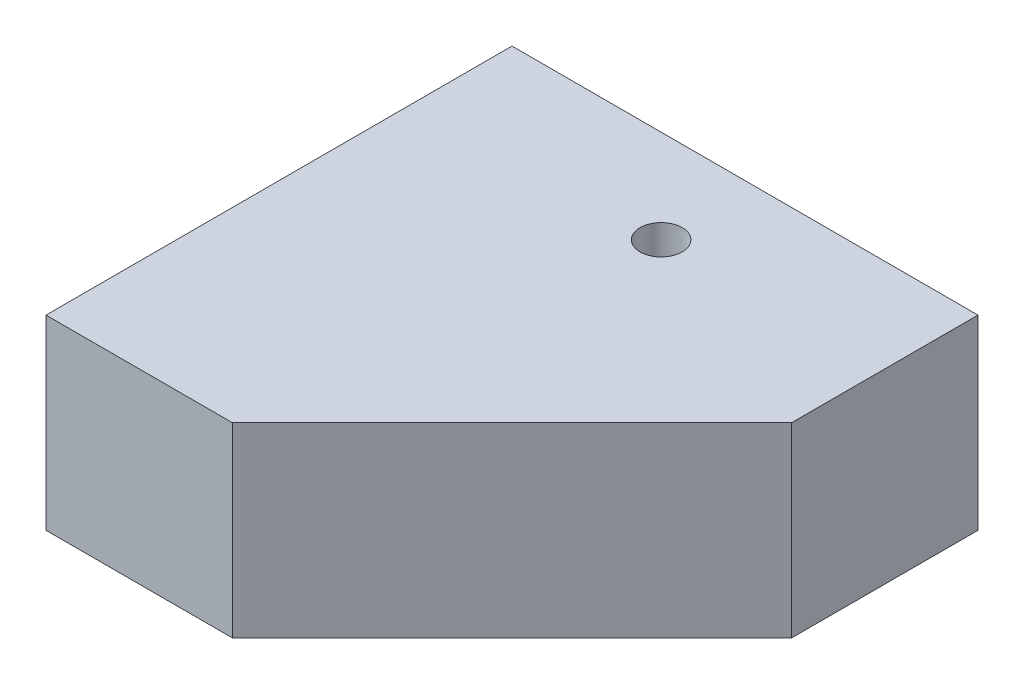
ISO-10303-21;
HEADER;
FILE_DESCRIPTION(('STEP AP214'),'2;1');
FILE_NAME('part.step','',(''),(''),'','','');
FILE_SCHEMA(('AUTOMOTIVE_DESIGN { 1 0 10303 214 1 1 1 1 }'));
ENDSEC;
DATA;
#1=APPLICATION_CONTEXT('core data for automotive mechanical design processes');
#2=APPLICATION_PROTOCOL_DEFINITION('international standard','automotive_design',2000,#1);
#3=PRODUCT_CONTEXT('',#1,'mechanical');
#4=PRODUCT('Part','Part','',(#3));
#5=PRODUCT_RELATED_PRODUCT_CATEGORY('part','',(#4));
#6=PRODUCT_DEFINITION_FORMATION('','',#4);
#7=PRODUCT_DEFINITION_CONTEXT('part definition',#1,'design');
#8=PRODUCT_DEFINITION('design','',#6,#7);
#9=PRODUCT_DEFINITION_SHAPE('','',#8);
#10=(LENGTH_UNIT() NAMED_UNIT(*) SI_UNIT(.MILLI.,.METRE.));
#11=(NAMED_UNIT(*) PLANE_ANGLE_UNIT() SI_UNIT($,.RADIAN.));
#12=(NAMED_UNIT(*) SI_UNIT($,.STERADIAN.) SOLID_ANGLE_UNIT());
#13=UNCERTAINTY_MEASURE_WITH_UNIT(LENGTH_MEASURE(1.E-05),#10,'distance_accuracy_value','');
#14=(GEOMETRIC_REPRESENTATION_CONTEXT(3) GLOBAL_UNCERTAINTY_ASSIGNED_CONTEXT((#13)) GLOBAL_UNIT_ASSIGNED_CONTEXT((#10,
#11,#12)) REPRESENTATION_CONTEXT('',''));
#15=CARTESIAN_POINT('',(0.,0.,0.));
#16=DIRECTION('',(0.,0.,1.));
#17=DIRECTION('',(1.,0.,0.));
#18=AXIS2_PLACEMENT_3D('',#15,#16,#17);
#19=CARTESIAN_POINT('',(10.,10.,0.));
#20=DIRECTION('',(0.,0.,-1.));
#21=DIRECTION('',(-1.,0.,0.));
#22=AXIS2_PLACEMENT_3D('',#19,#20,#21);
#23=PLANE('',#22);
#24=DIRECTION('',(1.,0.,0.));
#25=VECTOR('',#24,1.);
#26=CARTESIAN_POINT('',(10.,0.,0.));
#27=LINE('',#26,#25);
#28=CARTESIAN_POINT('',(0.,0.,0.));
#29=VERTEX_POINT('',#28);
#30=CARTESIAN_POINT('',(10.,0.,0.));
#31=VERTEX_POINT('',#30);
#32=EDGE_CURVE('E111',#29,#31,#27,.T.);
#33=ORIENTED_EDGE('',*,*,#32,.T.);
#34=DIRECTION('',(0.,-1.,0.));
#35=VECTOR('',#34,1.);
#36=CARTESIAN_POINT('',(10.,10.,0.));
#37=LINE('',#36,#35);
#38=CARTESIAN_POINT('',(10.,10.,0.));
#39=VERTEX_POINT('',#38);
#40=EDGE_CURVE('E11',#39,#31,#37,.T.);
#41=ORIENTED_EDGE('',*,*,#40,.F.);
#42=DIRECTION('',(1.,0.,0.));
#43=VECTOR('',#42,1.);
#44=CARTESIAN_POINT('',(10.,10.,0.));
#45=LINE('',#44,#43);
#46=CARTESIAN_POINT('',(0.,10.,0.));
#47=VERTEX_POINT('',#46);
#48=EDGE_CURVE('E120',#47,#39,#45,.T.);
#49=ORIENTED_EDGE('',*,*,#48,.F.);
#50=DIRECTION('',(0.,-1.,0.));
#51=VECTOR('',#50,1.);
#52=CARTESIAN_POINT('',(0.,10.,0.));
#53=LINE('',#52,#51);
#54=EDGE_CURVE('E107',#47,#29,#53,.T.);
#55=ORIENTED_EDGE('',*,*,#54,.T.);
#56=EDGE_LOOP('',(#33,#41,#49,#55));
#57=FACE_BOUND('',#56,.T.);
#58=ADVANCED_FACE('F34',(#57),#23,.F.);
#59=CARTESIAN_POINT('',(25.,10.,-15.));
#60=DIRECTION('',(-0.707106781186548,0.,-0.707106781186548));
#61=DIRECTION('',(-0.707106781186548,0.,0.707106781186548));
#62=AXIS2_PLACEMENT_3D('',#59,#60,#61);
#63=PLANE('',#62);
#64=DIRECTION('',(0.707106781186547,0.,-0.707106781186547));
#65=VECTOR('',#64,1.);
#66=CARTESIAN_POINT('',(25.,0.,-15.));
#67=LINE('',#66,#65);
#68=CARTESIAN_POINT('',(25.,0.,-15.));
#69=VERTEX_POINT('',#68);
#70=EDGE_CURVE('E114',#31,#69,#67,.T.);
#71=ORIENTED_EDGE('',*,*,#70,.T.);
#72=DIRECTION('',(0.,-1.,0.));
#73=VECTOR('',#72,1.);
#74=CARTESIAN_POINT('',(25.,10.,-15.));
#75=LINE('',#74,#73);
#76=CARTESIAN_POINT('',(25.,10.,-15.));
#77=VERTEX_POINT('',#76);
#78=EDGE_CURVE('E42',#77,#69,#75,.T.);
#79=ORIENTED_EDGE('',*,*,#78,.F.);
#80=DIRECTION('',(0.707106781186547,0.,-0.707106781186547));
#81=VECTOR('',#80,1.);
#82=CARTESIAN_POINT('',(25.,10.,-15.));
#83=LINE('',#82,#81);
#84=EDGE_CURVE('E85',#39,#77,#83,.T.);
#85=ORIENTED_EDGE('',*,*,#84,.F.);
#86=ORIENTED_EDGE('',*,*,#40,.T.);
#87=EDGE_LOOP('',(#71,#79,#85,#86));
#88=FACE_BOUND('',#87,.T.);
#89=ADVANCED_FACE('F143',(#88),#63,.F.);
#90=CARTESIAN_POINT('',(25.,10.,-25.));
#91=DIRECTION('',(-1.,0.,0.));
#92=DIRECTION('',(0.,0.,1.));
#93=AXIS2_PLACEMENT_3D('',#90,#91,#92);
#94=PLANE('',#93);
#95=DIRECTION('',(0.,0.,-1.));
#96=VECTOR('',#95,1.);
#97=CARTESIAN_POINT('',(25.,0.,-25.));
#98=LINE('',#97,#96);
#99=CARTESIAN_POINT('',(25.,0.,-25.));
#100=VERTEX_POINT('',#99);
#101=EDGE_CURVE('E102',#69,#100,#98,.T.);
#102=ORIENTED_EDGE('',*,*,#101,.T.);
#103=DIRECTION('',(0.,-1.,0.));
#104=VECTOR('',#103,1.);
#105=CARTESIAN_POINT('',(25.,10.,-25.));
#106=LINE('',#105,#104);
#107=CARTESIAN_POINT('',(25.,10.,-25.));
#108=VERTEX_POINT('',#107);
#109=EDGE_CURVE('E99',#108,#100,#106,.T.);
#110=ORIENTED_EDGE('',*,*,#109,.F.);
#111=DIRECTION('',(0.,0.,-1.));
#112=VECTOR('',#111,1.);
#113=CARTESIAN_POINT('',(25.,10.,-25.));
#114=LINE('',#113,#112);
#115=EDGE_CURVE('E91',#77,#108,#114,.T.);
#116=ORIENTED_EDGE('',*,*,#115,.F.);
#117=ORIENTED_EDGE('',*,*,#78,.T.);
#118=EDGE_LOOP('',(#102,#110,#116,#117));
#119=FACE_BOUND('',#118,.T.);
#120=ADVANCED_FACE('F100',(#119),#94,.F.);
#121=CARTESIAN_POINT('',(0.,10.,-25.));
#122=DIRECTION('',(0.,0.,1.));
#123=DIRECTION('',(1.,0.,0.));
#124=AXIS2_PLACEMENT_3D('',#121,#122,#123);
#125=PLANE('',#124);
#126=CARTESIAN_POINT('',(18.,5.,-25.));
#127=DIRECTION('',(0.,0.,-1.));
#128=DIRECTION('',(-1.,0.,0.));
#129=AXIS2_PLACEMENT_3D('',#126,#127,#128);
#130=CIRCLE('',#129,1.13029999999999);
#131=CARTESIAN_POINT('',(16.8697,5.,-25.));
#132=VERTEX_POINT('',#131);
#133=EDGE_CURVE('E224',#132,#132,#130,.T.);
#134=ORIENTED_EDGE('',*,*,#133,.F.);
#135=EDGE_LOOP('',(#134));
#136=FACE_BOUND('',#135,.T.);
#137=DIRECTION('',(-1.,0.,0.));
#138=VECTOR('',#137,1.);
#139=CARTESIAN_POINT('',(0.,0.,-25.));
#140=LINE('',#139,#138);
#141=CARTESIAN_POINT('',(0.,0.,-25.));
#142=VERTEX_POINT('',#141);
#143=EDGE_CURVE('E71',#100,#142,#140,.T.);
#144=ORIENTED_EDGE('',*,*,#143,.T.);
#145=DIRECTION('',(0.,-1.,0.));
#146=VECTOR('',#145,1.);
#147=CARTESIAN_POINT('',(0.,10.,-25.));
#148=LINE('',#147,#146);
#149=CARTESIAN_POINT('',(0.,10.,-25.));
#150=VERTEX_POINT('',#149);
#151=EDGE_CURVE('E103',#150,#142,#148,.T.);
#152=ORIENTED_EDGE('',*,*,#151,.F.);
#153=DIRECTION('',(-1.,0.,0.));
#154=VECTOR('',#153,1.);
#155=CARTESIAN_POINT('',(0.,10.,-25.));
#156=LINE('',#155,#154);
#157=EDGE_CURVE('E95',#108,#150,#156,.T.);
#158=ORIENTED_EDGE('',*,*,#157,.F.);
#159=ORIENTED_EDGE('',*,*,#109,.T.);
#160=EDGE_LOOP('',(#144,#152,#158,#159));
#161=FACE_BOUND('',#160,.T.);
#162=ADVANCED_FACE('F105',(#136,#161),#125,.F.);
#163=CARTESIAN_POINT('',(0.,10.,0.));
#164=DIRECTION('',(1.,0.,0.));
#165=DIRECTION('',(0.,0.,-1.));
#166=AXIS2_PLACEMENT_3D('',#163,#164,#165);
#167=PLANE('',#166);
#168=CARTESIAN_POINT('',(0.,5.,-15.));
#169=DIRECTION('',(-1.,0.,0.));
#170=DIRECTION('',(0.,0.,1.));
#171=AXIS2_PLACEMENT_3D('',#168,#169,#170);
#172=CIRCLE('',#171,1.13029999999999);
#173=CARTESIAN_POINT('',(0.,5.,-13.8697));
#174=VERTEX_POINT('',#173);
#175=EDGE_CURVE('E207',#174,#174,#172,.T.);
#176=ORIENTED_EDGE('',*,*,#175,.F.);
#177=EDGE_LOOP('',(#176));
#178=FACE_BOUND('',#177,.T.);
#179=DIRECTION('',(0.,0.,1.));
#180=VECTOR('',#179,1.);
#181=CARTESIAN_POINT('',(0.,0.,0.));
#182=LINE('',#181,#180);
#183=EDGE_CURVE('E77',#142,#29,#182,.T.);
#184=ORIENTED_EDGE('',*,*,#183,.T.);
#185=ORIENTED_EDGE('',*,*,#54,.F.);
#186=DIRECTION('',(0.,0.,1.));
#187=VECTOR('',#186,1.);
#188=CARTESIAN_POINT('',(0.,10.,0.));
#189=LINE('',#188,#187);
#190=EDGE_CURVE('E50',#150,#47,#189,.T.);
#191=ORIENTED_EDGE('',*,*,#190,.F.);
#192=ORIENTED_EDGE('',*,*,#151,.T.);
#193=EDGE_LOOP('',(#184,#185,#191,#192));
#194=FACE_BOUND('',#193,.T.);
#195=ADVANCED_FACE('F128',(#178,#194),#167,.F.);
#196=CARTESIAN_POINT('',(0.,10.,0.));
#197=DIRECTION('',(0.,-1.,0.));
#198=DIRECTION('',(0.,0.,-1.));
#199=AXIS2_PLACEMENT_3D('',#196,#197,#198);
#200=PLANE('',#199);
#201=CARTESIAN_POINT('',(13.,10.,-20.));
#202=DIRECTION('',(0.,1.,0.));
#203=DIRECTION('',(0.,0.,1.));
#204=AXIS2_PLACEMENT_3D('',#201,#202,#203);
#205=CIRCLE('',#204,1.13029999999999);
#206=CARTESIAN_POINT('',(13.,10.,-18.8697));
#207=VERTEX_POINT('',#206);
#208=EDGE_CURVE('E208',#207,#207,#205,.T.);
#209=ORIENTED_EDGE('',*,*,#208,.F.);
#210=EDGE_LOOP('',(#209));
#211=FACE_BOUND('',#210,.T.);
#212=ORIENTED_EDGE('',*,*,#48,.T.);
#213=ORIENTED_EDGE('',*,*,#84,.T.);
#214=ORIENTED_EDGE('',*,*,#115,.T.);
#215=ORIENTED_EDGE('',*,*,#157,.T.);
#216=ORIENTED_EDGE('',*,*,#190,.T.);
#217=EDGE_LOOP('',(#212,#213,#214,#215,#216));
#218=FACE_BOUND('',#217,.T.);
#219=ADVANCED_FACE('F93',(#211,#218),#200,.F.);
#220=CARTESIAN_POINT('',(0.,0.,0.));
#221=DIRECTION('',(0.,-1.,0.));
#222=DIRECTION('',(0.,0.,-1.));
#223=AXIS2_PLACEMENT_3D('',#220,#221,#222);
#224=PLANE('',#223);
#225=CARTESIAN_POINT('',(13.,0.,-20.));
#226=DIRECTION('',(0.,1.,0.));
#227=DIRECTION('',(0.,0.,1.));
#228=AXIS2_PLACEMENT_3D('',#225,#226,#227);
#229=CIRCLE('',#228,1.13029999999999);
#230=CARTESIAN_POINT('',(13.,0.,-18.8697));
#231=VERTEX_POINT('',#230);
#232=EDGE_CURVE('E206',#231,#231,#229,.T.);
#233=ORIENTED_EDGE('',*,*,#232,.T.);
#234=EDGE_LOOP('',(#233));
#235=FACE_BOUND('',#234,.T.);
#236=ORIENTED_EDGE('',*,*,#32,.F.);
#237=ORIENTED_EDGE('',*,*,#183,.F.);
#238=ORIENTED_EDGE('',*,*,#143,.F.);
#239=ORIENTED_EDGE('',*,*,#101,.F.);
#240=ORIENTED_EDGE('',*,*,#70,.F.);
#241=EDGE_LOOP('',(#236,#237,#238,#239,#240));
#242=FACE_BOUND('',#241,.T.);
#243=ADVANCED_FACE('F124',(#235,#242),#224,.T.);
#244=CARTESIAN_POINT('',(10.,5.,-15.));
#245=DIRECTION('',(-1.,0.,0.));
#246=DIRECTION('',(0.,0.,1.));
#247=AXIS2_PLACEMENT_3D('',#244,#245,#246);
#248=CONICAL_SURFACE('',#247,1.1303,1.02974425867665);
#249=CARTESIAN_POINT('',(10.6791527576869,5.,-15.));
#250=VERTEX_POINT('',#249);
#251=VERTEX_LOOP('',#250);
#252=FACE_BOUND('',#251,.T.);
#253=CARTESIAN_POINT('',(10.,5.,-15.));
#254=DIRECTION('',(-1.,0.,0.));
#255=DIRECTION('',(0.,0.,1.));
#256=AXIS2_PLACEMENT_3D('',#253,#254,#255);
#257=CIRCLE('',#256,1.1303);
#258=CARTESIAN_POINT('',(10.,5.,-13.8697));
#259=VERTEX_POINT('',#258);
#260=EDGE_CURVE('E115',#259,#259,#257,.T.);
#261=ORIENTED_EDGE('',*,*,#260,.T.);
#262=EDGE_LOOP('',(#261));
#263=FACE_BOUND('',#262,.T.);
#264=ADVANCED_FACE('F197',(#252,#263),#248,.F.);
#265=CARTESIAN_POINT('',(0.,5.,-15.));
#266=DIRECTION('',(-1.,0.,0.));
#267=DIRECTION('',(0.,0.,1.));
#268=AXIS2_PLACEMENT_3D('',#265,#266,#267);
#269=CYLINDRICAL_SURFACE('',#268,1.13029999999999);
#270=ORIENTED_EDGE('',*,*,#260,.F.);
#271=EDGE_LOOP('',(#270));
#272=FACE_BOUND('',#271,.T.);
#273=ORIENTED_EDGE('',*,*,#175,.T.);
#274=EDGE_LOOP('',(#273));
#275=FACE_BOUND('',#274,.T.);
#276=ADVANCED_FACE('F193',(#272,#275),#269,.F.);
#277=CARTESIAN_POINT('',(13.,10.,-20.));
#278=DIRECTION('',(0.,1.,0.));
#279=DIRECTION('',(0.,0.,1.));
#280=AXIS2_PLACEMENT_3D('',#277,#278,#279);
#281=CYLINDRICAL_SURFACE('',#280,1.13029999999999);
#282=ORIENTED_EDGE('',*,*,#232,.F.);
#283=EDGE_LOOP('',(#282));
#284=FACE_BOUND('',#283,.T.);
#285=ORIENTED_EDGE('',*,*,#208,.T.);
#286=EDGE_LOOP('',(#285));
#287=FACE_BOUND('',#286,.T.);
#288=ADVANCED_FACE('F164',(#284,#287),#281,.F.);
#289=CARTESIAN_POINT('',(18.,5.,-15.));
#290=DIRECTION('',(0.,0.,-1.));
#291=DIRECTION('',(-1.,0.,0.));
#292=AXIS2_PLACEMENT_3D('',#289,#290,#291);
#293=CONICAL_SURFACE('',#292,1.13029999999999,1.02974425867665);
#294=CARTESIAN_POINT('',(18.,5.,-14.3208472423132));
#295=VERTEX_POINT('',#294);
#296=VERTEX_LOOP('',#295);
#297=FACE_BOUND('',#296,.T.);
#298=CARTESIAN_POINT('',(18.,5.,-15.));
#299=DIRECTION('',(0.,0.,-1.));
#300=DIRECTION('',(-1.,0.,0.));
#301=AXIS2_PLACEMENT_3D('',#298,#299,#300);
#302=CIRCLE('',#301,1.13029999999999);
#303=CARTESIAN_POINT('',(16.8697,5.,-15.));
#304=VERTEX_POINT('',#303);
#305=EDGE_CURVE('E213',#304,#304,#302,.T.);
#306=ORIENTED_EDGE('',*,*,#305,.T.);
#307=EDGE_LOOP('',(#306));
#308=FACE_BOUND('',#307,.T.);
#309=ADVANCED_FACE('F169',(#297,#308),#293,.F.);
#310=CARTESIAN_POINT('',(18.,5.,-25.));
#311=DIRECTION('',(0.,0.,-1.));
#312=DIRECTION('',(-1.,0.,0.));
#313=AXIS2_PLACEMENT_3D('',#310,#311,#312);
#314=CYLINDRICAL_SURFACE('',#313,1.13029999999999);
#315=ORIENTED_EDGE('',*,*,#305,.F.);
#316=EDGE_LOOP('',(#315));
#317=FACE_BOUND('',#316,.T.);
#318=ORIENTED_EDGE('',*,*,#133,.T.);
#319=EDGE_LOOP('',(#318));
#320=FACE_BOUND('',#319,.T.);
#321=ADVANCED_FACE('F174',(#317,#320),#314,.F.);
#322=CLOSED_SHELL('',(#58,#89,#120,#162,#195,#219,#243,#264,#276,#288,#309,#321));
#323=MANIFOLD_SOLID_BREP('B2',#322);
#324=ADVANCED_BREP_SHAPE_REPRESENTATION('',(#18,#323),#14);
#325=SHAPE_DEFINITION_REPRESENTATION(#9,#324);
ENDSEC;
END-ISO-10303-21;
